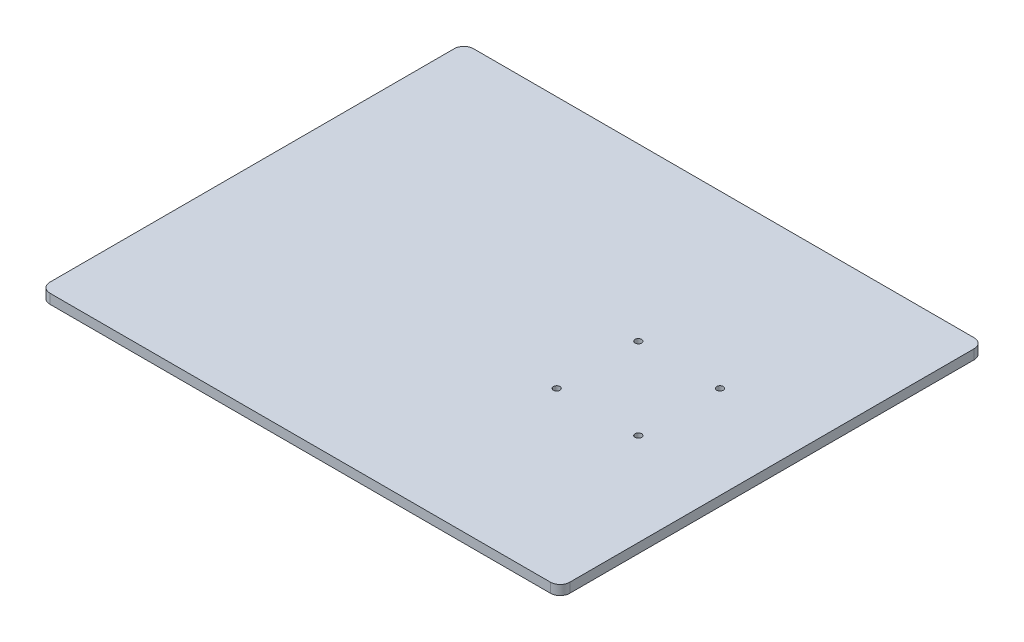
ISO-10303-21;
HEADER;
FILE_DESCRIPTION(('STEP AP214'),'2;1');
FILE_NAME('part.step','',(''),(''),'','','');
FILE_SCHEMA(('AUTOMOTIVE_DESIGN { 1 0 10303 214 1 1 1 1 }'));
ENDSEC;
DATA;
#1=APPLICATION_CONTEXT('core data for automotive mechanical design processes');
#2=APPLICATION_PROTOCOL_DEFINITION('international standard','automotive_design',2000,#1);
#3=PRODUCT_CONTEXT('',#1,'mechanical');
#4=PRODUCT('Part','Part','',(#3));
#5=PRODUCT_RELATED_PRODUCT_CATEGORY('part','',(#4));
#6=PRODUCT_DEFINITION_FORMATION('','',#4);
#7=PRODUCT_DEFINITION_CONTEXT('part definition',#1,'design');
#8=PRODUCT_DEFINITION('design','',#6,#7);
#9=PRODUCT_DEFINITION_SHAPE('','',#8);
#10=(LENGTH_UNIT() NAMED_UNIT(*) SI_UNIT(.MILLI.,.METRE.));
#11=(NAMED_UNIT(*) PLANE_ANGLE_UNIT() SI_UNIT($,.RADIAN.));
#12=(NAMED_UNIT(*) SI_UNIT($,.STERADIAN.) SOLID_ANGLE_UNIT());
#13=UNCERTAINTY_MEASURE_WITH_UNIT(LENGTH_MEASURE(1.E-05),#10,'distance_accuracy_value','');
#14=(GEOMETRIC_REPRESENTATION_CONTEXT(3) GLOBAL_UNCERTAINTY_ASSIGNED_CONTEXT((#13)) GLOBAL_UNIT_ASSIGNED_CONTEXT((#10,
#11,#12)) REPRESENTATION_CONTEXT('',''));
#15=CARTESIAN_POINT('',(0.,0.,0.));
#16=DIRECTION('',(0.,0.,1.));
#17=DIRECTION('',(1.,0.,0.));
#18=AXIS2_PLACEMENT_3D('',#15,#16,#17);
#19=CARTESIAN_POINT('',(-260.,10.,210.));
#20=DIRECTION('',(0.,-1.,0.));
#21=DIRECTION('',(0.,0.,-1.));
#22=AXIS2_PLACEMENT_3D('',#19,#20,#21);
#23=CYLINDRICAL_SURFACE('',#22,10.);
#24=CARTESIAN_POINT('',(-260.,0.,210.));
#25=DIRECTION('',(0.,1.,0.));
#26=DIRECTION('',(0.,0.,-1.));
#27=AXIS2_PLACEMENT_3D('',#24,#25,#26);
#28=CIRCLE('',#27,10.);
#29=CARTESIAN_POINT('',(-270.,0.,210.));
#30=VERTEX_POINT('',#29);
#31=CARTESIAN_POINT('',(-260.,0.,220.));
#32=VERTEX_POINT('',#31);
#33=EDGE_CURVE('E135',#30,#32,#28,.T.);
#34=ORIENTED_EDGE('',*,*,#33,.T.);
#35=DIRECTION('',(0.,-1.,0.));
#36=VECTOR('',#35,1.);
#37=CARTESIAN_POINT('',(-260.,10.,220.));
#38=LINE('',#37,#36);
#39=CARTESIAN_POINT('',(-260.,10.,220.));
#40=VERTEX_POINT('',#39);
#41=EDGE_CURVE('E11',#40,#32,#38,.T.);
#42=ORIENTED_EDGE('',*,*,#41,.F.);
#43=CARTESIAN_POINT('',(-260.,10.,210.));
#44=DIRECTION('',(0.,1.,0.));
#45=DIRECTION('',(0.,0.,-1.));
#46=AXIS2_PLACEMENT_3D('',#43,#44,#45);
#47=CIRCLE('',#46,10.);
#48=CARTESIAN_POINT('',(-270.,10.,210.));
#49=VERTEX_POINT('',#48);
#50=EDGE_CURVE('E150',#49,#40,#47,.T.);
#51=ORIENTED_EDGE('',*,*,#50,.F.);
#52=DIRECTION('',(0.,-1.,0.));
#53=VECTOR('',#52,1.);
#54=CARTESIAN_POINT('',(-270.,10.,210.));
#55=LINE('',#54,#53);
#56=EDGE_CURVE('E131',#49,#30,#55,.T.);
#57=ORIENTED_EDGE('',*,*,#56,.T.);
#58=EDGE_LOOP('',(#34,#42,#51,#57));
#59=FACE_BOUND('',#58,.T.);
#60=ADVANCED_FACE('F37',(#59),#23,.T.);
#61=CARTESIAN_POINT('',(260.,10.,220.));
#62=DIRECTION('',(0.,0.,-1.));
#63=DIRECTION('',(-1.,0.,0.));
#64=AXIS2_PLACEMENT_3D('',#61,#62,#63);
#65=PLANE('',#64);
#66=DIRECTION('',(1.,0.,0.));
#67=VECTOR('',#66,1.);
#68=CARTESIAN_POINT('',(260.,0.,220.));
#69=LINE('',#68,#67);
#70=CARTESIAN_POINT('',(260.,0.,220.));
#71=VERTEX_POINT('',#70);
#72=EDGE_CURVE('E138',#32,#71,#69,.T.);
#73=ORIENTED_EDGE('',*,*,#72,.T.);
#74=DIRECTION('',(0.,-1.,0.));
#75=VECTOR('',#74,1.);
#76=CARTESIAN_POINT('',(260.,10.,220.));
#77=LINE('',#76,#75);
#78=CARTESIAN_POINT('',(260.,10.,220.));
#79=VERTEX_POINT('',#78);
#80=EDGE_CURVE('E46',#79,#71,#77,.T.);
#81=ORIENTED_EDGE('',*,*,#80,.F.);
#82=DIRECTION('',(1.,0.,0.));
#83=VECTOR('',#82,1.);
#84=CARTESIAN_POINT('',(260.,10.,220.));
#85=LINE('',#84,#83);
#86=EDGE_CURVE('E98',#40,#79,#85,.T.);
#87=ORIENTED_EDGE('',*,*,#86,.F.);
#88=ORIENTED_EDGE('',*,*,#41,.T.);
#89=EDGE_LOOP('',(#73,#81,#87,#88));
#90=FACE_BOUND('',#89,.T.);
#91=ADVANCED_FACE('F219',(#90),#65,.F.);
#92=CARTESIAN_POINT('',(260.,10.,210.));
#93=DIRECTION('',(0.,-1.,0.));
#94=DIRECTION('',(0.,0.,-1.));
#95=AXIS2_PLACEMENT_3D('',#92,#93,#94);
#96=CYLINDRICAL_SURFACE('',#95,10.);
#97=CARTESIAN_POINT('',(260.,0.,210.));
#98=DIRECTION('',(0.,1.,0.));
#99=DIRECTION('',(0.,0.,1.));
#100=AXIS2_PLACEMENT_3D('',#97,#98,#99);
#101=CIRCLE('',#100,10.);
#102=CARTESIAN_POINT('',(270.,0.,210.));
#103=VERTEX_POINT('',#102);
#104=EDGE_CURVE('E141',#71,#103,#101,.T.);
#105=ORIENTED_EDGE('',*,*,#104,.T.);
#106=DIRECTION('',(0.,-1.,0.));
#107=VECTOR('',#106,1.);
#108=CARTESIAN_POINT('',(270.,10.,210.));
#109=LINE('',#108,#107);
#110=CARTESIAN_POINT('',(270.,10.,210.));
#111=VERTEX_POINT('',#110);
#112=EDGE_CURVE('E157',#111,#103,#109,.T.);
#113=ORIENTED_EDGE('',*,*,#112,.F.);
#114=CARTESIAN_POINT('',(260.,10.,210.));
#115=DIRECTION('',(0.,1.,0.));
#116=DIRECTION('',(0.,0.,1.));
#117=AXIS2_PLACEMENT_3D('',#114,#115,#116);
#118=CIRCLE('',#117,10.);
#119=EDGE_CURVE('E187',#79,#111,#118,.T.);
#120=ORIENTED_EDGE('',*,*,#119,.F.);
#121=ORIENTED_EDGE('',*,*,#80,.T.);
#122=EDGE_LOOP('',(#105,#113,#120,#121));
#123=FACE_BOUND('',#122,.T.);
#124=ADVANCED_FACE('F223',(#123),#96,.T.);
#125=CARTESIAN_POINT('',(270.,10.,210.));
#126=DIRECTION('',(-1.,0.,0.));
#127=DIRECTION('',(0.,0.,1.));
#128=AXIS2_PLACEMENT_3D('',#125,#126,#127);
#129=PLANE('',#128);
#130=DIRECTION('',(0.,0.,-1.));
#131=VECTOR('',#130,1.);
#132=CARTESIAN_POINT('',(270.,0.,210.));
#133=LINE('',#132,#131);
#134=CARTESIAN_POINT('',(270.,0.,-210.));
#135=VERTEX_POINT('',#134);
#136=EDGE_CURVE('E143',#103,#135,#133,.T.);
#137=ORIENTED_EDGE('',*,*,#136,.T.);
#138=DIRECTION('',(0.,-1.,0.));
#139=VECTOR('',#138,1.);
#140=CARTESIAN_POINT('',(270.,10.,-210.));
#141=LINE('',#140,#139);
#142=CARTESIAN_POINT('',(270.,10.,-210.));
#143=VERTEX_POINT('',#142);
#144=EDGE_CURVE('E154',#143,#135,#141,.T.);
#145=ORIENTED_EDGE('',*,*,#144,.F.);
#146=DIRECTION('',(0.,0.,-1.));
#147=VECTOR('',#146,1.);
#148=CARTESIAN_POINT('',(270.,10.,210.));
#149=LINE('',#148,#147);
#150=EDGE_CURVE('E189',#111,#143,#149,.T.);
#151=ORIENTED_EDGE('',*,*,#150,.F.);
#152=ORIENTED_EDGE('',*,*,#112,.T.);
#153=EDGE_LOOP('',(#137,#145,#151,#152));
#154=FACE_BOUND('',#153,.T.);
#155=ADVANCED_FACE('F195',(#154),#129,.F.);
#156=CARTESIAN_POINT('',(260.,10.,-210.));
#157=DIRECTION('',(0.,-1.,0.));
#158=DIRECTION('',(0.,0.,-1.));
#159=AXIS2_PLACEMENT_3D('',#156,#157,#158);
#160=CYLINDRICAL_SURFACE('',#159,10.);
#161=CARTESIAN_POINT('',(260.,0.,-210.));
#162=DIRECTION('',(0.,1.,0.));
#163=DIRECTION('',(0.,0.,1.));
#164=AXIS2_PLACEMENT_3D('',#161,#162,#163);
#165=CIRCLE('',#164,10.);
#166=CARTESIAN_POINT('',(260.,0.,-220.));
#167=VERTEX_POINT('',#166);
#168=EDGE_CURVE('E145',#135,#167,#165,.T.);
#169=ORIENTED_EDGE('',*,*,#168,.T.);
#170=DIRECTION('',(0.,-1.,0.));
#171=VECTOR('',#170,1.);
#172=CARTESIAN_POINT('',(260.,10.,-220.));
#173=LINE('',#172,#171);
#174=CARTESIAN_POINT('',(260.,10.,-220.));
#175=VERTEX_POINT('',#174);
#176=EDGE_CURVE('E126',#175,#167,#173,.T.);
#177=ORIENTED_EDGE('',*,*,#176,.F.);
#178=CARTESIAN_POINT('',(260.,10.,-210.));
#179=DIRECTION('',(0.,1.,0.));
#180=DIRECTION('',(0.,0.,1.));
#181=AXIS2_PLACEMENT_3D('',#178,#179,#180);
#182=CIRCLE('',#181,10.);
#183=EDGE_CURVE('E117',#143,#175,#182,.T.);
#184=ORIENTED_EDGE('',*,*,#183,.F.);
#185=ORIENTED_EDGE('',*,*,#144,.T.);
#186=EDGE_LOOP('',(#169,#177,#184,#185));
#187=FACE_BOUND('',#186,.T.);
#188=ADVANCED_FACE('F199',(#187),#160,.T.);
#189=CARTESIAN_POINT('',(260.,10.,-220.));
#190=DIRECTION('',(0.,0.,1.));
#191=DIRECTION('',(1.,0.,0.));
#192=AXIS2_PLACEMENT_3D('',#189,#190,#191);
#193=PLANE('',#192);
#194=DIRECTION('',(-1.,0.,0.));
#195=VECTOR('',#194,1.);
#196=CARTESIAN_POINT('',(260.,0.,-220.));
#197=LINE('',#196,#195);
#198=CARTESIAN_POINT('',(-260.,0.,-220.));
#199=VERTEX_POINT('',#198);
#200=EDGE_CURVE('E125',#167,#199,#197,.T.);
#201=ORIENTED_EDGE('',*,*,#200,.T.);
#202=DIRECTION('',(0.,-1.,0.));
#203=VECTOR('',#202,1.);
#204=CARTESIAN_POINT('',(-260.,10.,-220.));
#205=LINE('',#204,#203);
#206=CARTESIAN_POINT('',(-260.,10.,-220.));
#207=VERTEX_POINT('',#206);
#208=EDGE_CURVE('E122',#207,#199,#205,.T.);
#209=ORIENTED_EDGE('',*,*,#208,.F.);
#210=DIRECTION('',(-1.,0.,0.));
#211=VECTOR('',#210,1.);
#212=CARTESIAN_POINT('',(260.,10.,-220.));
#213=LINE('',#212,#211);
#214=EDGE_CURVE('E111',#175,#207,#213,.T.);
#215=ORIENTED_EDGE('',*,*,#214,.F.);
#216=ORIENTED_EDGE('',*,*,#176,.T.);
#217=EDGE_LOOP('',(#201,#209,#215,#216));
#218=FACE_BOUND('',#217,.T.);
#219=ADVANCED_FACE('F123',(#218),#193,.F.);
#220=CARTESIAN_POINT('',(-260.,10.,-210.));
#221=DIRECTION('',(0.,-1.,0.));
#222=DIRECTION('',(0.,0.,-1.));
#223=AXIS2_PLACEMENT_3D('',#220,#221,#222);
#224=CYLINDRICAL_SURFACE('',#223,10.);
#225=CARTESIAN_POINT('',(-260.,0.,-210.));
#226=DIRECTION('',(0.,1.,0.));
#227=DIRECTION('',(0.,0.,1.));
#228=AXIS2_PLACEMENT_3D('',#225,#226,#227);
#229=CIRCLE('',#228,10.);
#230=CARTESIAN_POINT('',(-270.,0.,-210.));
#231=VERTEX_POINT('',#230);
#232=EDGE_CURVE('E84',#199,#231,#229,.T.);
#233=ORIENTED_EDGE('',*,*,#232,.T.);
#234=DIRECTION('',(0.,-1.,0.));
#235=VECTOR('',#234,1.);
#236=CARTESIAN_POINT('',(-270.,10.,-210.));
#237=LINE('',#236,#235);
#238=CARTESIAN_POINT('',(-270.,10.,-210.));
#239=VERTEX_POINT('',#238);
#240=EDGE_CURVE('E127',#239,#231,#237,.T.);
#241=ORIENTED_EDGE('',*,*,#240,.F.);
#242=CARTESIAN_POINT('',(-260.,10.,-210.));
#243=DIRECTION('',(0.,1.,0.));
#244=DIRECTION('',(0.,0.,1.));
#245=AXIS2_PLACEMENT_3D('',#242,#243,#244);
#246=CIRCLE('',#245,10.);
#247=EDGE_CURVE('E115',#207,#239,#246,.T.);
#248=ORIENTED_EDGE('',*,*,#247,.F.);
#249=ORIENTED_EDGE('',*,*,#208,.T.);
#250=EDGE_LOOP('',(#233,#241,#248,#249));
#251=FACE_BOUND('',#250,.T.);
#252=ADVANCED_FACE('F129',(#251),#224,.T.);
#253=CARTESIAN_POINT('',(-270.,10.,210.));
#254=DIRECTION('',(1.,0.,0.));
#255=DIRECTION('',(0.,0.,-1.));
#256=AXIS2_PLACEMENT_3D('',#253,#254,#255);
#257=PLANE('',#256);
#258=DIRECTION('',(0.,0.,1.));
#259=VECTOR('',#258,1.);
#260=CARTESIAN_POINT('',(-270.,0.,210.));
#261=LINE('',#260,#259);
#262=EDGE_CURVE('E90',#231,#30,#261,.T.);
#263=ORIENTED_EDGE('',*,*,#262,.T.);
#264=ORIENTED_EDGE('',*,*,#56,.F.);
#265=DIRECTION('',(0.,0.,1.));
#266=VECTOR('',#265,1.);
#267=CARTESIAN_POINT('',(-270.,10.,210.));
#268=LINE('',#267,#266);
#269=EDGE_CURVE('E55',#239,#49,#268,.T.);
#270=ORIENTED_EDGE('',*,*,#269,.F.);
#271=ORIENTED_EDGE('',*,*,#240,.T.);
#272=EDGE_LOOP('',(#263,#264,#270,#271));
#273=FACE_BOUND('',#272,.T.);
#274=ADVANCED_FACE('F207',(#273),#257,.F.);
#275=CARTESIAN_POINT('',(-260.,10.,210.));
#276=DIRECTION('',(0.,-1.,0.));
#277=DIRECTION('',(0.,0.,-1.));
#278=AXIS2_PLACEMENT_3D('',#275,#276,#277);
#279=PLANE('',#278);
#280=CARTESIAN_POINT('',(88.8157987407331,10.,-42.4264068711929));
#281=DIRECTION('',(0.,1.,0.));
#282=DIRECTION('',(0.,0.,1.));
#283=AXIS2_PLACEMENT_3D('',#280,#281,#282);
#284=CIRCLE('',#283,3.39999999999999);
#285=CARTESIAN_POINT('',(88.8157987407331,10.,-39.0264068711929));
#286=VERTEX_POINT('',#285);
#287=EDGE_CURVE('E178',#286,#286,#284,.T.);
#288=ORIENTED_EDGE('',*,*,#287,.F.);
#289=EDGE_LOOP('',(#288));
#290=FACE_BOUND('',#289,.T.);
#291=CARTESIAN_POINT('',(88.8157987407331,10.,42.4264068711929));
#292=DIRECTION('',(0.,1.,0.));
#293=DIRECTION('',(0.,0.,1.));
#294=AXIS2_PLACEMENT_3D('',#291,#292,#293);
#295=CIRCLE('',#294,3.39999999999999);
#296=CARTESIAN_POINT('',(88.8157987407331,10.,45.8264068711929));
#297=VERTEX_POINT('',#296);
#298=EDGE_CURVE('E168',#297,#297,#295,.T.);
#299=ORIENTED_EDGE('',*,*,#298,.F.);
#300=EDGE_LOOP('',(#299));
#301=FACE_BOUND('',#300,.T.);
#302=CARTESIAN_POINT('',(173.668612483119,10.,42.4264068711929));
#303=DIRECTION('',(0.,1.,0.));
#304=DIRECTION('',(0.,0.,1.));
#305=AXIS2_PLACEMENT_3D('',#302,#303,#304);
#306=CIRCLE('',#305,3.39999999999999);
#307=CARTESIAN_POINT('',(173.668612483119,10.,45.8264068711929));
#308=VERTEX_POINT('',#307);
#309=EDGE_CURVE('E165',#308,#308,#306,.T.);
#310=ORIENTED_EDGE('',*,*,#309,.F.);
#311=EDGE_LOOP('',(#310));
#312=FACE_BOUND('',#311,.T.);
#313=CARTESIAN_POINT('',(173.668612483119,10.,-42.4264068711929));
#314=DIRECTION('',(0.,1.,0.));
#315=DIRECTION('',(0.,0.,1.));
#316=AXIS2_PLACEMENT_3D('',#313,#314,#315);
#317=CIRCLE('',#316,3.39999999999999);
#318=CARTESIAN_POINT('',(173.668612483119,10.,-39.0264068711929));
#319=VERTEX_POINT('',#318);
#320=EDGE_CURVE('E164',#319,#319,#317,.T.);
#321=ORIENTED_EDGE('',*,*,#320,.F.);
#322=EDGE_LOOP('',(#321));
#323=FACE_BOUND('',#322,.T.);
#324=ORIENTED_EDGE('',*,*,#50,.T.);
#325=ORIENTED_EDGE('',*,*,#86,.T.);
#326=ORIENTED_EDGE('',*,*,#119,.T.);
#327=ORIENTED_EDGE('',*,*,#150,.T.);
#328=ORIENTED_EDGE('',*,*,#183,.T.);
#329=ORIENTED_EDGE('',*,*,#214,.T.);
#330=ORIENTED_EDGE('',*,*,#247,.T.);
#331=ORIENTED_EDGE('',*,*,#269,.T.);
#332=EDGE_LOOP('',(#324,#325,#326,#327,#328,#329,#330,#331));
#333=FACE_BOUND('',#332,.T.);
#334=ADVANCED_FACE('F113',(#290,#301,#312,#323,#333),#279,.F.);
#335=CARTESIAN_POINT('',(-260.,0.,210.));
#336=DIRECTION('',(0.,-1.,0.));
#337=DIRECTION('',(0.,0.,-1.));
#338=AXIS2_PLACEMENT_3D('',#335,#336,#337);
#339=PLANE('',#338);
#340=CARTESIAN_POINT('',(88.8157987407331,0.,-42.4264068711929));
#341=DIRECTION('',(0.,-1.,0.));
#342=DIRECTION('',(0.,0.,-1.));
#343=AXIS2_PLACEMENT_3D('',#340,#341,#342);
#344=CIRCLE('',#343,3.39999999999999);
#345=CARTESIAN_POINT('',(88.8157987407331,0.,-45.8264068711928));
#346=VERTEX_POINT('',#345);
#347=EDGE_CURVE('E40',#346,#346,#344,.T.);
#348=ORIENTED_EDGE('',*,*,#347,.F.);
#349=EDGE_LOOP('',(#348));
#350=FACE_BOUND('',#349,.T.);
#351=CARTESIAN_POINT('',(88.8157987407331,0.,42.4264068711929));
#352=DIRECTION('',(0.,-1.,0.));
#353=DIRECTION('',(0.,0.,-1.));
#354=AXIS2_PLACEMENT_3D('',#351,#352,#353);
#355=CIRCLE('',#354,3.39999999999999);
#356=CARTESIAN_POINT('',(88.8157987407331,0.,39.0264068711929));
#357=VERTEX_POINT('',#356);
#358=EDGE_CURVE('E166',#357,#357,#355,.T.);
#359=ORIENTED_EDGE('',*,*,#358,.F.);
#360=EDGE_LOOP('',(#359));
#361=FACE_BOUND('',#360,.T.);
#362=CARTESIAN_POINT('',(173.668612483119,0.,42.4264068711929));
#363=DIRECTION('',(0.,-1.,0.));
#364=DIRECTION('',(0.,0.,-1.));
#365=AXIS2_PLACEMENT_3D('',#362,#363,#364);
#366=CIRCLE('',#365,3.39999999999999);
#367=CARTESIAN_POINT('',(173.668612483119,0.,39.0264068711929));
#368=VERTEX_POINT('',#367);
#369=EDGE_CURVE('E162',#368,#368,#366,.T.);
#370=ORIENTED_EDGE('',*,*,#369,.F.);
#371=EDGE_LOOP('',(#370));
#372=FACE_BOUND('',#371,.T.);
#373=CARTESIAN_POINT('',(173.668612483119,0.,-42.4264068711929));
#374=DIRECTION('',(0.,-1.,0.));
#375=DIRECTION('',(0.,0.,-1.));
#376=AXIS2_PLACEMENT_3D('',#373,#374,#375);
#377=CIRCLE('',#376,3.39999999999999);
#378=CARTESIAN_POINT('',(173.668612483119,0.,-45.8264068711929));
#379=VERTEX_POINT('',#378);
#380=EDGE_CURVE('E139',#379,#379,#377,.T.);
#381=ORIENTED_EDGE('',*,*,#380,.F.);
#382=EDGE_LOOP('',(#381));
#383=FACE_BOUND('',#382,.T.);
#384=ORIENTED_EDGE('',*,*,#33,.F.);
#385=ORIENTED_EDGE('',*,*,#262,.F.);
#386=ORIENTED_EDGE('',*,*,#232,.F.);
#387=ORIENTED_EDGE('',*,*,#200,.F.);
#388=ORIENTED_EDGE('',*,*,#168,.F.);
#389=ORIENTED_EDGE('',*,*,#136,.F.);
#390=ORIENTED_EDGE('',*,*,#104,.F.);
#391=ORIENTED_EDGE('',*,*,#72,.F.);
#392=EDGE_LOOP('',(#384,#385,#386,#387,#388,#389,#390,#391));
#393=FACE_BOUND('',#392,.T.);
#394=ADVANCED_FACE('F202',(#350,#361,#372,#383,#393),#339,.T.);
#395=CARTESIAN_POINT('',(173.668612483119,10.,-42.4264068711929));
#396=DIRECTION('',(0.,1.,0.));
#397=DIRECTION('',(0.,0.,1.));
#398=AXIS2_PLACEMENT_3D('',#395,#396,#397);
#399=CYLINDRICAL_SURFACE('',#398,3.39999999999999);
#400=ORIENTED_EDGE('',*,*,#380,.T.);
#401=EDGE_LOOP('',(#400));
#402=FACE_BOUND('',#401,.T.);
#403=ORIENTED_EDGE('',*,*,#320,.T.);
#404=EDGE_LOOP('',(#403));
#405=FACE_BOUND('',#404,.T.);
#406=ADVANCED_FACE('F262',(#402,#405),#399,.F.);
#407=CARTESIAN_POINT('',(173.668612483119,10.,42.4264068711929));
#408=DIRECTION('',(0.,1.,0.));
#409=DIRECTION('',(0.,0.,1.));
#410=AXIS2_PLACEMENT_3D('',#407,#408,#409);
#411=CYLINDRICAL_SURFACE('',#410,3.39999999999999);
#412=ORIENTED_EDGE('',*,*,#369,.T.);
#413=EDGE_LOOP('',(#412));
#414=FACE_BOUND('',#413,.T.);
#415=ORIENTED_EDGE('',*,*,#309,.T.);
#416=EDGE_LOOP('',(#415));
#417=FACE_BOUND('',#416,.T.);
#418=ADVANCED_FACE('F272',(#414,#417),#411,.F.);
#419=CARTESIAN_POINT('',(88.8157987407331,10.,42.4264068711929));
#420=DIRECTION('',(0.,1.,0.));
#421=DIRECTION('',(0.,0.,1.));
#422=AXIS2_PLACEMENT_3D('',#419,#420,#421);
#423=CYLINDRICAL_SURFACE('',#422,3.39999999999999);
#424=ORIENTED_EDGE('',*,*,#358,.T.);
#425=EDGE_LOOP('',(#424));
#426=FACE_BOUND('',#425,.T.);
#427=ORIENTED_EDGE('',*,*,#298,.T.);
#428=EDGE_LOOP('',(#427));
#429=FACE_BOUND('',#428,.T.);
#430=ADVANCED_FACE('F283',(#426,#429),#423,.F.);
#431=CARTESIAN_POINT('',(88.8157987407331,10.,-42.4264068711929));
#432=DIRECTION('',(0.,1.,0.));
#433=DIRECTION('',(0.,0.,1.));
#434=AXIS2_PLACEMENT_3D('',#431,#432,#433);
#435=CYLINDRICAL_SURFACE('',#434,3.39999999999999);
#436=ORIENTED_EDGE('',*,*,#347,.T.);
#437=EDGE_LOOP('',(#436));
#438=FACE_BOUND('',#437,.T.);
#439=ORIENTED_EDGE('',*,*,#287,.T.);
#440=EDGE_LOOP('',(#439));
#441=FACE_BOUND('',#440,.T.);
#442=ADVANCED_FACE('F294',(#438,#441),#435,.F.);
#443=CLOSED_SHELL('',(#60,#91,#124,#155,#188,#219,#252,#274,#334,#394,#406,#418,#430,#442));
#444=MANIFOLD_SOLID_BREP('B2',#443);
#445=ADVANCED_BREP_SHAPE_REPRESENTATION('',(#18,#444),#14);
#446=SHAPE_DEFINITION_REPRESENTATION(#9,#445);
ENDSEC;
END-ISO-10303-21;
